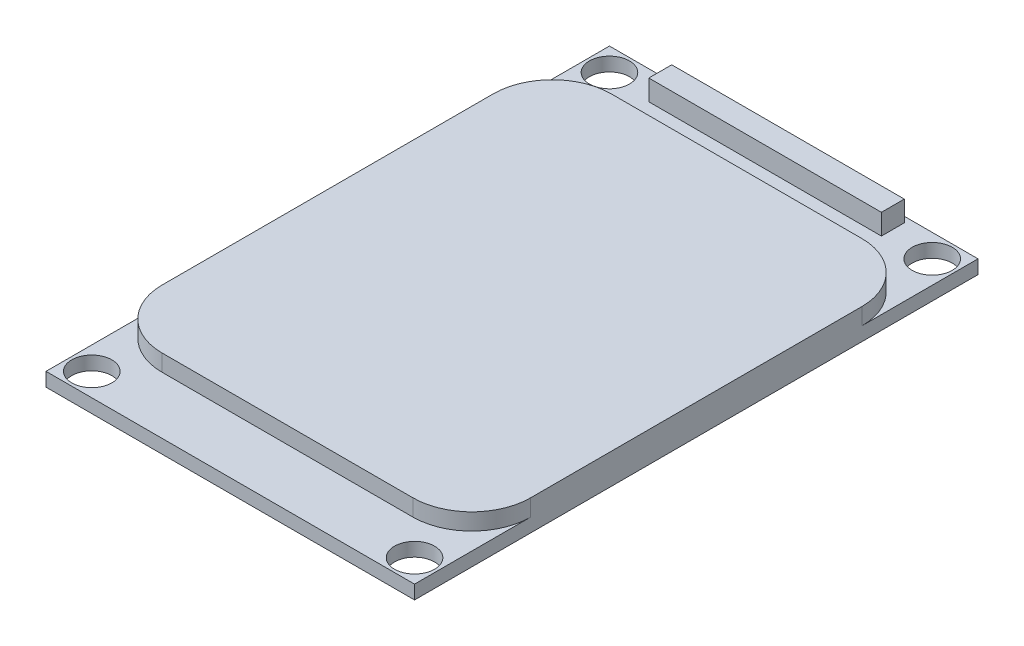
ISO-10303-21;
HEADER;
FILE_DESCRIPTION(('STEP AP214'),'2;1');
FILE_NAME('part.step','',(''),(''),'','','');
FILE_SCHEMA(('AUTOMOTIVE_DESIGN { 1 0 10303 214 1 1 1 1 }'));
ENDSEC;
DATA;
#1=APPLICATION_CONTEXT('core data for automotive mechanical design processes');
#2=APPLICATION_PROTOCOL_DEFINITION('international standard','automotive_design',2000,#1);
#3=PRODUCT_CONTEXT('',#1,'mechanical');
#4=PRODUCT('Part','Part','',(#3));
#5=PRODUCT_RELATED_PRODUCT_CATEGORY('part','',(#4));
#6=PRODUCT_DEFINITION_FORMATION('','',#4);
#7=PRODUCT_DEFINITION_CONTEXT('part definition',#1,'design');
#8=PRODUCT_DEFINITION('design','',#6,#7);
#9=PRODUCT_DEFINITION_SHAPE('','',#8);
#10=(LENGTH_UNIT() NAMED_UNIT(*) SI_UNIT(.MILLI.,.METRE.));
#11=(NAMED_UNIT(*) PLANE_ANGLE_UNIT() SI_UNIT($,.RADIAN.));
#12=(NAMED_UNIT(*) SI_UNIT($,.STERADIAN.) SOLID_ANGLE_UNIT());
#13=UNCERTAINTY_MEASURE_WITH_UNIT(LENGTH_MEASURE(1.E-05),#10,'distance_accuracy_value','');
#14=(GEOMETRIC_REPRESENTATION_CONTEXT(3) GLOBAL_UNCERTAINTY_ASSIGNED_CONTEXT((#13)) GLOBAL_UNIT_ASSIGNED_CONTEXT((#10,
#11,#12)) REPRESENTATION_CONTEXT('',''));
#15=CARTESIAN_POINT('',(0.,0.,0.));
#16=DIRECTION('',(0.,0.,1.));
#17=DIRECTION('',(1.,0.,0.));
#18=AXIS2_PLACEMENT_3D('',#15,#16,#17);
#19=CARTESIAN_POINT('',(0.,1.2,0.));
#20=DIRECTION('',(0.,1.,0.));
#21=DIRECTION('',(0.,0.,1.));
#22=AXIS2_PLACEMENT_3D('',#19,#20,#21);
#23=PLANE('',#22);
#24=CARTESIAN_POINT('',(-13.1368010723274,1.2,28.9138056680162));
#25=DIRECTION('',(0.,1.,0.));
#26=DIRECTION('',(0.,0.,1.));
#27=AXIS2_PLACEMENT_3D('',#24,#25,#26);
#28=CIRCLE('',#27,1.75);
#29=CARTESIAN_POINT('',(-13.1368010723274,1.2,30.6638056680162));
#30=VERTEX_POINT('',#29);
#31=EDGE_CURVE('E168',#30,#30,#28,.T.);
#32=ORIENTED_EDGE('',*,*,#31,.F.);
#33=EDGE_LOOP('',(#32));
#34=FACE_BOUND('',#33,.T.);
#35=CARTESIAN_POINT('',(15.0631989276726,1.2,28.9138056680162));
#36=DIRECTION('',(0.,1.,0.));
#37=DIRECTION('',(0.,0.,1.));
#38=AXIS2_PLACEMENT_3D('',#35,#36,#37);
#39=CIRCLE('',#38,1.75);
#40=CARTESIAN_POINT('',(15.0631989276726,1.2,30.6638056680162));
#41=VERTEX_POINT('',#40);
#42=EDGE_CURVE('E180',#41,#41,#39,.T.);
#43=ORIENTED_EDGE('',*,*,#42,.F.);
#44=EDGE_LOOP('',(#43));
#45=FACE_BOUND('',#44,.T.);
#46=DIRECTION('',(1.,0.,0.));
#47=VECTOR('',#46,1.);
#48=CARTESIAN_POINT('',(11.9131989276726,1.2,25.9138056680162));
#49=LINE('',#48,#47);
#50=CARTESIAN_POINT('',(-9.98680107232734,1.2,25.9138056680162));
#51=VERTEX_POINT('',#50);
#52=CARTESIAN_POINT('',(11.9131989276726,1.2,25.9138056680162));
#53=VERTEX_POINT('',#52);
#54=EDGE_CURVE('E49',#51,#53,#49,.T.);
#55=ORIENTED_EDGE('',*,*,#54,.F.);
#56=CARTESIAN_POINT('',(-9.98680107232738,1.2,20.7638056680162));
#57=DIRECTION('',(0.,1.,0.));
#58=DIRECTION('',(0.,0.,1.));
#59=AXIS2_PLACEMENT_3D('',#56,#57,#58);
#60=CIRCLE('',#59,5.15);
#61=CARTESIAN_POINT('',(-15.1368010723274,1.2,20.7638056680162));
#62=VERTEX_POINT('',#61);
#63=EDGE_CURVE('E167',#62,#51,#60,.T.);
#64=ORIENTED_EDGE('',*,*,#63,.F.);
#65=DIRECTION('',(0.,0.,1.));
#66=VECTOR('',#65,1.);
#67=CARTESIAN_POINT('',(-15.1368010723274,1.2,-18.3161943319838));
#68=LINE('',#67,#66);
#69=CARTESIAN_POINT('',(-15.1368010723274,1.2,30.9138056680162));
#70=VERTEX_POINT('',#69);
#71=EDGE_CURVE('E223',#62,#70,#68,.T.);
#72=ORIENTED_EDGE('',*,*,#71,.T.);
#73=DIRECTION('',(1.,0.,0.));
#74=VECTOR('',#73,1.);
#75=CARTESIAN_POINT('',(-15.1368010723274,1.2,30.9138056680162));
#76=LINE('',#75,#74);
#77=CARTESIAN_POINT('',(17.0631989276726,1.2,30.9138056680162));
#78=VERTEX_POINT('',#77);
#79=EDGE_CURVE('E222',#70,#78,#76,.T.);
#80=ORIENTED_EDGE('',*,*,#79,.T.);
#81=DIRECTION('',(0.,0.,-1.));
#82=VECTOR('',#81,1.);
#83=CARTESIAN_POINT('',(17.0631989276726,1.2,-18.3161943319838));
#84=LINE('',#83,#82);
#85=CARTESIAN_POINT('',(17.0631989276726,1.2,20.7638056680162));
#86=VERTEX_POINT('',#85);
#87=EDGE_CURVE('E226',#78,#86,#84,.T.);
#88=ORIENTED_EDGE('',*,*,#87,.T.);
#89=CARTESIAN_POINT('',(11.9131989276726,1.2,20.7638056680162));
#90=DIRECTION('',(0.,1.,0.));
#91=DIRECTION('',(0.,0.,-1.));
#92=AXIS2_PLACEMENT_3D('',#89,#90,#91);
#93=CIRCLE('',#92,5.15);
#94=EDGE_CURVE('E54',#53,#86,#93,.T.);
#95=ORIENTED_EDGE('',*,*,#94,.F.);
#96=EDGE_LOOP('',(#55,#64,#72,#80,#88,#95));
#97=FACE_BOUND('',#96,.T.);
#98=ADVANCED_FACE('F32',(#34,#45,#97),#23,.T.);
#99=DIRECTION('',(1.,0.,0.));
#100=VECTOR('',#99,1.);
#101=CARTESIAN_POINT('',(-9.19680107232738,1.2,-15.8161943319838));
#102=LINE('',#101,#100);
#103=CARTESIAN_POINT('',(-9.19680107232738,1.2,-15.8161943319838));
#104=VERTEX_POINT('',#103);
#105=CARTESIAN_POINT('',(11.1231989276726,1.2,-15.8161943319838));
#106=VERTEX_POINT('',#105);
#107=EDGE_CURVE('E202',#104,#106,#102,.T.);
#108=ORIENTED_EDGE('',*,*,#107,.F.);
#109=DIRECTION('',(0.,0.,1.));
#110=VECTOR('',#109,1.);
#111=CARTESIAN_POINT('',(-9.19680107232738,1.2,-17.8161943319838));
#112=LINE('',#111,#110);
#113=CARTESIAN_POINT('',(-9.19680107232738,1.2,-17.8161943319838));
#114=VERTEX_POINT('',#113);
#115=EDGE_CURVE('E199',#114,#104,#112,.T.);
#116=ORIENTED_EDGE('',*,*,#115,.F.);
#117=DIRECTION('',(1.,0.,0.));
#118=VECTOR('',#117,1.);
#119=CARTESIAN_POINT('',(-9.19680107232738,1.2,-17.8161943319838));
#120=LINE('',#119,#118);
#121=CARTESIAN_POINT('',(11.1231989276726,1.2,-17.8161943319838));
#122=VERTEX_POINT('',#121);
#123=EDGE_CURVE('E190',#114,#122,#120,.T.);
#124=ORIENTED_EDGE('',*,*,#123,.T.);
#125=DIRECTION('',(0.,0.,1.));
#126=VECTOR('',#125,1.);
#127=CARTESIAN_POINT('',(11.1231989276726,1.2,-17.8161943319838));
#128=LINE('',#127,#126);
#129=EDGE_CURVE('E205',#122,#106,#128,.T.);
#130=ORIENTED_EDGE('',*,*,#129,.T.);
#131=EDGE_LOOP('',(#108,#116,#124,#130));
#132=FACE_BOUND('',#131,.T.);
#133=CARTESIAN_POINT('',(15.0631989276726,1.2,-16.3161943319838));
#134=DIRECTION('',(0.,1.,0.));
#135=DIRECTION('',(0.,0.,1.));
#136=AXIS2_PLACEMENT_3D('',#133,#134,#135);
#137=CIRCLE('',#136,1.75);
#138=CARTESIAN_POINT('',(15.0631989276726,1.2,-14.5661943319838));
#139=VERTEX_POINT('',#138);
#140=EDGE_CURVE('E177',#139,#139,#137,.T.);
#141=ORIENTED_EDGE('',*,*,#140,.F.);
#142=EDGE_LOOP('',(#141));
#143=FACE_BOUND('',#142,.T.);
#144=CARTESIAN_POINT('',(-13.1368010723274,1.2,-16.3161943319838));
#145=DIRECTION('',(0.,1.,0.));
#146=DIRECTION('',(0.,0.,1.));
#147=AXIS2_PLACEMENT_3D('',#144,#145,#146);
#148=CIRCLE('',#147,1.75);
#149=CARTESIAN_POINT('',(-13.1368010723274,1.2,-14.5661943319838));
#150=VERTEX_POINT('',#149);
#151=EDGE_CURVE('E171',#150,#150,#148,.T.);
#152=ORIENTED_EDGE('',*,*,#151,.F.);
#153=EDGE_LOOP('',(#152));
#154=FACE_BOUND('',#153,.T.);
#155=DIRECTION('',(-1.,0.,0.));
#156=VECTOR('',#155,1.);
#157=CARTESIAN_POINT('',(-9.98680107232734,1.2,-13.3161943319838));
#158=LINE('',#157,#156);
#159=CARTESIAN_POINT('',(11.9131989276726,1.2,-13.3161943319838));
#160=VERTEX_POINT('',#159);
#161=CARTESIAN_POINT('',(-9.98680107232734,1.2,-13.3161943319838));
#162=VERTEX_POINT('',#161);
#163=EDGE_CURVE('E329',#160,#162,#158,.T.);
#164=ORIENTED_EDGE('',*,*,#163,.F.);
#165=CARTESIAN_POINT('',(11.9131989276726,1.2,-8.1661943319838));
#166=DIRECTION('',(0.,1.,0.));
#167=DIRECTION('',(0.,0.,1.));
#168=AXIS2_PLACEMENT_3D('',#165,#166,#167);
#169=CIRCLE('',#168,5.15);
#170=CARTESIAN_POINT('',(17.0631989276726,1.2,-8.16619433198376));
#171=VERTEX_POINT('',#170);
#172=EDGE_CURVE('E331',#171,#160,#169,.T.);
#173=ORIENTED_EDGE('',*,*,#172,.F.);
#174=CARTESIAN_POINT('',(17.0631989276726,1.2,-18.3161943319838));
#175=VERTEX_POINT('',#174);
#176=EDGE_CURVE('E225',#171,#175,#84,.T.);
#177=ORIENTED_EDGE('',*,*,#176,.T.);
#178=DIRECTION('',(-1.,0.,0.));
#179=VECTOR('',#178,1.);
#180=CARTESIAN_POINT('',(-15.1368010723274,1.2,-18.3161943319838));
#181=LINE('',#180,#179);
#182=CARTESIAN_POINT('',(-15.1368010723274,1.2,-18.3161943319838));
#183=VERTEX_POINT('',#182);
#184=EDGE_CURVE('E228',#175,#183,#181,.T.);
#185=ORIENTED_EDGE('',*,*,#184,.T.);
#186=CARTESIAN_POINT('',(-15.1368010723274,1.2,-8.16619433198376));
#187=VERTEX_POINT('',#186);
#188=EDGE_CURVE('E220',#183,#187,#68,.T.);
#189=ORIENTED_EDGE('',*,*,#188,.T.);
#190=CARTESIAN_POINT('',(-9.98680107232738,1.2,-8.1661943319838));
#191=DIRECTION('',(0.,1.,0.));
#192=DIRECTION('',(0.,0.,1.));
#193=AXIS2_PLACEMENT_3D('',#190,#191,#192);
#194=CIRCLE('',#193,5.15);
#195=EDGE_CURVE('E164',#162,#187,#194,.T.);
#196=ORIENTED_EDGE('',*,*,#195,.F.);
#197=EDGE_LOOP('',(#164,#173,#177,#185,#189,#196));
#198=FACE_BOUND('',#197,.T.);
#199=ADVANCED_FACE('F275',(#132,#143,#154,#198),#23,.T.);
#200=CARTESIAN_POINT('',(-15.1368010723274,1.2,-18.3161943319838));
#201=DIRECTION('',(1.,0.,0.));
#202=DIRECTION('',(0.,0.,-1.));
#203=AXIS2_PLACEMENT_3D('',#200,#201,#202);
#204=PLANE('',#203);
#205=DIRECTION('',(0.,0.,1.));
#206=VECTOR('',#205,1.);
#207=CARTESIAN_POINT('',(-15.1368010723274,0.,-18.3161943319838));
#208=LINE('',#207,#206);
#209=CARTESIAN_POINT('',(-15.1368010723274,0.,-18.3161943319838));
#210=VERTEX_POINT('',#209);
#211=CARTESIAN_POINT('',(-15.1368010723274,0.,30.9138056680162));
#212=VERTEX_POINT('',#211);
#213=EDGE_CURVE('E219',#210,#212,#208,.T.);
#214=ORIENTED_EDGE('',*,*,#213,.T.);
#215=DIRECTION('',(0.,-1.,0.));
#216=VECTOR('',#215,1.);
#217=CARTESIAN_POINT('',(-15.1368010723274,1.2,30.9138056680162));
#218=LINE('',#217,#216);
#219=EDGE_CURVE('E11',#70,#212,#218,.T.);
#220=ORIENTED_EDGE('',*,*,#219,.F.);
#221=ORIENTED_EDGE('',*,*,#71,.F.);
#222=DIRECTION('',(0.,-1.,0.));
#223=VECTOR('',#222,1.);
#224=CARTESIAN_POINT('',(-15.1368010723274,2.66,20.7638056680162));
#225=LINE('',#224,#223);
#226=CARTESIAN_POINT('',(-15.1368010723274,2.66,20.7638056680162));
#227=VERTEX_POINT('',#226);
#228=EDGE_CURVE('E335',#227,#62,#225,.T.);
#229=ORIENTED_EDGE('',*,*,#228,.F.);
#230=DIRECTION('',(0.,0.,1.));
#231=VECTOR('',#230,1.);
#232=CARTESIAN_POINT('',(-15.1368010723274,2.66,20.7638056680162));
#233=LINE('',#232,#231);
#234=CARTESIAN_POINT('',(-15.1368010723274,2.66,-8.16619433198376));
#235=VERTEX_POINT('',#234);
#236=EDGE_CURVE('E160',#235,#227,#233,.T.);
#237=ORIENTED_EDGE('',*,*,#236,.F.);
#238=DIRECTION('',(0.,-1.,0.));
#239=VECTOR('',#238,1.);
#240=CARTESIAN_POINT('',(-15.1368010723274,2.66,-8.16619433198376));
#241=LINE('',#240,#239);
#242=EDGE_CURVE('E319',#235,#187,#241,.T.);
#243=ORIENTED_EDGE('',*,*,#242,.T.);
#244=ORIENTED_EDGE('',*,*,#188,.F.);
#245=DIRECTION('',(0.,-1.,0.));
#246=VECTOR('',#245,1.);
#247=CARTESIAN_POINT('',(-15.1368010723274,1.2,-18.3161943319838));
#248=LINE('',#247,#246);
#249=EDGE_CURVE('E230',#183,#210,#248,.T.);
#250=ORIENTED_EDGE('',*,*,#249,.T.);
#251=EDGE_LOOP('',(#214,#220,#221,#229,#237,#243,#244,#250));
#252=FACE_BOUND('',#251,.T.);
#253=ADVANCED_FACE('F34',(#252),#204,.F.);
#254=CARTESIAN_POINT('',(-15.1368010723274,1.2,30.9138056680162));
#255=DIRECTION('',(0.,0.,-1.));
#256=DIRECTION('',(-1.,0.,0.));
#257=AXIS2_PLACEMENT_3D('',#254,#255,#256);
#258=PLANE('',#257);
#259=DIRECTION('',(1.,0.,0.));
#260=VECTOR('',#259,1.);
#261=CARTESIAN_POINT('',(-15.1368010723274,0.,30.9138056680162));
#262=LINE('',#261,#260);
#263=CARTESIAN_POINT('',(17.0631989276726,0.,30.9138056680162));
#264=VERTEX_POINT('',#263);
#265=EDGE_CURVE('E233',#212,#264,#262,.T.);
#266=ORIENTED_EDGE('',*,*,#265,.T.);
#267=DIRECTION('',(0.,-1.,0.));
#268=VECTOR('',#267,1.);
#269=CARTESIAN_POINT('',(17.0631989276726,1.2,30.9138056680162));
#270=LINE('',#269,#268);
#271=EDGE_CURVE('E41',#78,#264,#270,.T.);
#272=ORIENTED_EDGE('',*,*,#271,.F.);
#273=ORIENTED_EDGE('',*,*,#79,.F.);
#274=ORIENTED_EDGE('',*,*,#219,.T.);
#275=EDGE_LOOP('',(#266,#272,#273,#274));
#276=FACE_BOUND('',#275,.T.);
#277=ADVANCED_FACE('F296',(#276),#258,.F.);
#278=CARTESIAN_POINT('',(17.0631989276726,1.2,-18.3161943319838));
#279=DIRECTION('',(-1.,0.,0.));
#280=DIRECTION('',(0.,0.,1.));
#281=AXIS2_PLACEMENT_3D('',#278,#279,#280);
#282=PLANE('',#281);
#283=DIRECTION('',(0.,0.,-1.));
#284=VECTOR('',#283,1.);
#285=CARTESIAN_POINT('',(17.0631989276726,0.,-18.3161943319838));
#286=LINE('',#285,#284);
#287=CARTESIAN_POINT('',(17.0631989276726,0.,-18.3161943319838));
#288=VERTEX_POINT('',#287);
#289=EDGE_CURVE('E235',#264,#288,#286,.T.);
#290=ORIENTED_EDGE('',*,*,#289,.T.);
#291=DIRECTION('',(0.,-1.,0.));
#292=VECTOR('',#291,1.);
#293=CARTESIAN_POINT('',(17.0631989276726,1.2,-18.3161943319838));
#294=LINE('',#293,#292);
#295=EDGE_CURVE('E241',#175,#288,#294,.T.);
#296=ORIENTED_EDGE('',*,*,#295,.F.);
#297=ORIENTED_EDGE('',*,*,#176,.F.);
#298=DIRECTION('',(0.,-1.,0.));
#299=VECTOR('',#298,1.);
#300=CARTESIAN_POINT('',(17.0631989276726,2.66,-8.16619433198376));
#301=LINE('',#300,#299);
#302=CARTESIAN_POINT('',(17.0631989276726,2.66,-8.16619433198376));
#303=VERTEX_POINT('',#302);
#304=EDGE_CURVE('E342',#303,#171,#301,.T.);
#305=ORIENTED_EDGE('',*,*,#304,.F.);
#306=DIRECTION('',(0.,0.,-1.));
#307=VECTOR('',#306,1.);
#308=CARTESIAN_POINT('',(17.0631989276726,2.66,-8.16619433198376));
#309=LINE('',#308,#307);
#310=CARTESIAN_POINT('',(17.0631989276726,2.66,20.7638056680162));
#311=VERTEX_POINT('',#310);
#312=EDGE_CURVE('E347',#311,#303,#309,.T.);
#313=ORIENTED_EDGE('',*,*,#312,.F.);
#314=DIRECTION('',(0.,-1.,0.));
#315=VECTOR('',#314,1.);
#316=CARTESIAN_POINT('',(17.0631989276726,2.66,20.7638056680162));
#317=LINE('',#316,#315);
#318=EDGE_CURVE('E173',#311,#86,#317,.T.);
#319=ORIENTED_EDGE('',*,*,#318,.T.);
#320=ORIENTED_EDGE('',*,*,#87,.F.);
#321=ORIENTED_EDGE('',*,*,#271,.T.);
#322=EDGE_LOOP('',(#290,#296,#297,#305,#313,#319,#320,#321));
#323=FACE_BOUND('',#322,.T.);
#324=ADVANCED_FACE('F293',(#323),#282,.F.);
#325=CARTESIAN_POINT('',(-15.1368010723274,1.2,-18.3161943319838));
#326=DIRECTION('',(0.,0.,1.));
#327=DIRECTION('',(1.,0.,0.));
#328=AXIS2_PLACEMENT_3D('',#325,#326,#327);
#329=PLANE('',#328);
#330=DIRECTION('',(-1.,0.,0.));
#331=VECTOR('',#330,1.);
#332=CARTESIAN_POINT('',(-15.1368010723274,0.,-18.3161943319838));
#333=LINE('',#332,#331);
#334=EDGE_CURVE('E237',#288,#210,#333,.T.);
#335=ORIENTED_EDGE('',*,*,#334,.T.);
#336=ORIENTED_EDGE('',*,*,#249,.F.);
#337=ORIENTED_EDGE('',*,*,#184,.F.);
#338=ORIENTED_EDGE('',*,*,#295,.T.);
#339=EDGE_LOOP('',(#335,#336,#337,#338));
#340=FACE_BOUND('',#339,.T.);
#341=ADVANCED_FACE('F290',(#340),#329,.F.);
#342=CARTESIAN_POINT('',(0.,0.,0.));
#343=DIRECTION('',(0.,1.,0.));
#344=DIRECTION('',(0.,0.,1.));
#345=AXIS2_PLACEMENT_3D('',#342,#343,#344);
#346=PLANE('',#345);
#347=CARTESIAN_POINT('',(-13.1368010723274,0.,28.9138056680162));
#348=DIRECTION('',(0.,1.,0.));
#349=DIRECTION('',(0.,0.,1.));
#350=AXIS2_PLACEMENT_3D('',#347,#348,#349);
#351=CIRCLE('',#350,1.75);
#352=CARTESIAN_POINT('',(-13.1368010723274,0.,30.6638056680162));
#353=VERTEX_POINT('',#352);
#354=EDGE_CURVE('E36',#353,#353,#351,.T.);
#355=ORIENTED_EDGE('',*,*,#354,.T.);
#356=EDGE_LOOP('',(#355));
#357=FACE_BOUND('',#356,.T.);
#358=CARTESIAN_POINT('',(-13.1368010723274,0.,-16.3161943319838));
#359=DIRECTION('',(0.,1.,0.));
#360=DIRECTION('',(0.,0.,1.));
#361=AXIS2_PLACEMENT_3D('',#358,#359,#360);
#362=CIRCLE('',#361,1.75);
#363=CARTESIAN_POINT('',(-13.1368010723274,0.,-14.5661943319838));
#364=VERTEX_POINT('',#363);
#365=EDGE_CURVE('E250',#364,#364,#362,.T.);
#366=ORIENTED_EDGE('',*,*,#365,.T.);
#367=EDGE_LOOP('',(#366));
#368=FACE_BOUND('',#367,.T.);
#369=CARTESIAN_POINT('',(15.0631989276726,0.,-16.3161943319838));
#370=DIRECTION('',(0.,1.,0.));
#371=DIRECTION('',(0.,0.,1.));
#372=AXIS2_PLACEMENT_3D('',#369,#370,#371);
#373=CIRCLE('',#372,1.75);
#374=CARTESIAN_POINT('',(15.0631989276726,0.,-14.5661943319838));
#375=VERTEX_POINT('',#374);
#376=EDGE_CURVE('E248',#375,#375,#373,.T.);
#377=ORIENTED_EDGE('',*,*,#376,.T.);
#378=EDGE_LOOP('',(#377));
#379=FACE_BOUND('',#378,.T.);
#380=CARTESIAN_POINT('',(15.0631989276726,0.,28.9138056680162));
#381=DIRECTION('',(0.,1.,0.));
#382=DIRECTION('',(0.,0.,1.));
#383=AXIS2_PLACEMENT_3D('',#380,#381,#382);
#384=CIRCLE('',#383,1.75);
#385=CARTESIAN_POINT('',(15.0631989276726,0.,30.6638056680162));
#386=VERTEX_POINT('',#385);
#387=EDGE_CURVE('E185',#386,#386,#384,.T.);
#388=ORIENTED_EDGE('',*,*,#387,.T.);
#389=EDGE_LOOP('',(#388));
#390=FACE_BOUND('',#389,.T.);
#391=ORIENTED_EDGE('',*,*,#213,.F.);
#392=ORIENTED_EDGE('',*,*,#334,.F.);
#393=ORIENTED_EDGE('',*,*,#289,.F.);
#394=ORIENTED_EDGE('',*,*,#265,.F.);
#395=EDGE_LOOP('',(#391,#392,#393,#394));
#396=FACE_BOUND('',#395,.T.);
#397=ADVANCED_FACE('F257',(#357,#368,#379,#390,#396),#346,.F.);
#398=CARTESIAN_POINT('',(-9.19680107232738,3.,-17.8161943319838));
#399=DIRECTION('',(1.,0.,0.));
#400=DIRECTION('',(0.,0.,-1.));
#401=AXIS2_PLACEMENT_3D('',#398,#399,#400);
#402=PLANE('',#401);
#403=ORIENTED_EDGE('',*,*,#115,.T.);
#404=DIRECTION('',(0.,-1.,0.));
#405=VECTOR('',#404,1.);
#406=CARTESIAN_POINT('',(-9.19680107232738,3.,-15.8161943319838));
#407=LINE('',#406,#405);
#408=CARTESIAN_POINT('',(-9.19680107232738,3.,-15.8161943319838));
#409=VERTEX_POINT('',#408);
#410=EDGE_CURVE('E216',#409,#104,#407,.T.);
#411=ORIENTED_EDGE('',*,*,#410,.F.);
#412=DIRECTION('',(0.,0.,1.));
#413=VECTOR('',#412,1.);
#414=CARTESIAN_POINT('',(-9.19680107232738,3.,-17.8161943319838));
#415=LINE('',#414,#413);
#416=CARTESIAN_POINT('',(-9.19680107232738,3.,-17.8161943319838));
#417=VERTEX_POINT('',#416);
#418=EDGE_CURVE('E186',#417,#409,#415,.T.);
#419=ORIENTED_EDGE('',*,*,#418,.F.);
#420=DIRECTION('',(0.,-1.,0.));
#421=VECTOR('',#420,1.);
#422=CARTESIAN_POINT('',(-9.19680107232738,3.,-17.8161943319838));
#423=LINE('',#422,#421);
#424=EDGE_CURVE('E198',#417,#114,#423,.T.);
#425=ORIENTED_EDGE('',*,*,#424,.T.);
#426=EDGE_LOOP('',(#403,#411,#419,#425));
#427=FACE_BOUND('',#426,.T.);
#428=ADVANCED_FACE('F286',(#427),#402,.F.);
#429=CARTESIAN_POINT('',(-9.19680107232738,3.,-15.8161943319838));
#430=DIRECTION('',(0.,0.,-1.));
#431=DIRECTION('',(-1.,0.,0.));
#432=AXIS2_PLACEMENT_3D('',#429,#430,#431);
#433=PLANE('',#432);
#434=ORIENTED_EDGE('',*,*,#107,.T.);
#435=DIRECTION('',(0.,-1.,0.));
#436=VECTOR('',#435,1.);
#437=CARTESIAN_POINT('',(11.1231989276726,3.,-15.8161943319838));
#438=LINE('',#437,#436);
#439=CARTESIAN_POINT('',(11.1231989276726,3.,-15.8161943319838));
#440=VERTEX_POINT('',#439);
#441=EDGE_CURVE('E213',#440,#106,#438,.T.);
#442=ORIENTED_EDGE('',*,*,#441,.F.);
#443=DIRECTION('',(1.,0.,0.));
#444=VECTOR('',#443,1.);
#445=CARTESIAN_POINT('',(-9.19680107232738,3.,-15.8161943319838));
#446=LINE('',#445,#444);
#447=EDGE_CURVE('E189',#409,#440,#446,.T.);
#448=ORIENTED_EDGE('',*,*,#447,.F.);
#449=ORIENTED_EDGE('',*,*,#410,.T.);
#450=EDGE_LOOP('',(#434,#442,#448,#449));
#451=FACE_BOUND('',#450,.T.);
#452=ADVANCED_FACE('F416',(#451),#433,.F.);
#453=CARTESIAN_POINT('',(11.1231989276726,3.,-17.8161943319838));
#454=DIRECTION('',(1.,0.,0.));
#455=DIRECTION('',(0.,0.,-1.));
#456=AXIS2_PLACEMENT_3D('',#453,#454,#455);
#457=PLANE('',#456);
#458=ORIENTED_EDGE('',*,*,#129,.F.);
#459=DIRECTION('',(0.,-1.,0.));
#460=VECTOR('',#459,1.);
#461=CARTESIAN_POINT('',(11.1231989276726,3.,-17.8161943319838));
#462=LINE('',#461,#460);
#463=CARTESIAN_POINT('',(11.1231989276726,3.,-17.8161943319838));
#464=VERTEX_POINT('',#463);
#465=EDGE_CURVE('E210',#464,#122,#462,.T.);
#466=ORIENTED_EDGE('',*,*,#465,.F.);
#467=DIRECTION('',(0.,0.,1.));
#468=VECTOR('',#467,1.);
#469=CARTESIAN_POINT('',(11.1231989276726,3.,-17.8161943319838));
#470=LINE('',#469,#468);
#471=EDGE_CURVE('E192',#464,#440,#470,.T.);
#472=ORIENTED_EDGE('',*,*,#471,.T.);
#473=ORIENTED_EDGE('',*,*,#441,.T.);
#474=EDGE_LOOP('',(#458,#466,#472,#473));
#475=FACE_BOUND('',#474,.T.);
#476=ADVANCED_FACE('F413',(#475),#457,.T.);
#477=CARTESIAN_POINT('',(-9.19680107232738,3.,-17.8161943319838));
#478=DIRECTION('',(0.,0.,-1.));
#479=DIRECTION('',(-1.,0.,0.));
#480=AXIS2_PLACEMENT_3D('',#477,#478,#479);
#481=PLANE('',#480);
#482=ORIENTED_EDGE('',*,*,#123,.F.);
#483=ORIENTED_EDGE('',*,*,#424,.F.);
#484=DIRECTION('',(1.,0.,0.));
#485=VECTOR('',#484,1.);
#486=CARTESIAN_POINT('',(-9.19680107232738,3.,-17.8161943319838));
#487=LINE('',#486,#485);
#488=EDGE_CURVE('E195',#417,#464,#487,.T.);
#489=ORIENTED_EDGE('',*,*,#488,.T.);
#490=ORIENTED_EDGE('',*,*,#465,.T.);
#491=EDGE_LOOP('',(#482,#483,#489,#490));
#492=FACE_BOUND('',#491,.T.);
#493=ADVANCED_FACE('F407',(#492),#481,.T.);
#494=CARTESIAN_POINT('',(0.,3.,0.));
#495=DIRECTION('',(0.,1.,0.));
#496=DIRECTION('',(0.,0.,1.));
#497=AXIS2_PLACEMENT_3D('',#494,#495,#496);
#498=PLANE('',#497);
#499=ORIENTED_EDGE('',*,*,#418,.T.);
#500=ORIENTED_EDGE('',*,*,#447,.T.);
#501=ORIENTED_EDGE('',*,*,#471,.F.);
#502=ORIENTED_EDGE('',*,*,#488,.F.);
#503=EDGE_LOOP('',(#499,#500,#501,#502));
#504=FACE_BOUND('',#503,.T.);
#505=ADVANCED_FACE('F391',(#504),#498,.T.);
#506=CARTESIAN_POINT('',(15.0631989276726,-0.6,28.9138056680162));
#507=DIRECTION('',(0.,1.,0.));
#508=DIRECTION('',(0.,0.,1.));
#509=AXIS2_PLACEMENT_3D('',#506,#507,#508);
#510=CYLINDRICAL_SURFACE('',#509,1.75);
#511=ORIENTED_EDGE('',*,*,#42,.T.);
#512=EDGE_LOOP('',(#511));
#513=FACE_BOUND('',#512,.T.);
#514=ORIENTED_EDGE('',*,*,#387,.F.);
#515=EDGE_LOOP('',(#514));
#516=FACE_BOUND('',#515,.T.);
#517=ADVANCED_FACE('F386',(#513,#516),#510,.F.);
#518=CARTESIAN_POINT('',(15.0631989276726,-0.6,-16.3161943319838));
#519=DIRECTION('',(0.,1.,0.));
#520=DIRECTION('',(0.,0.,1.));
#521=AXIS2_PLACEMENT_3D('',#518,#519,#520);
#522=CYLINDRICAL_SURFACE('',#521,1.75);
#523=ORIENTED_EDGE('',*,*,#140,.T.);
#524=EDGE_LOOP('',(#523));
#525=FACE_BOUND('',#524,.T.);
#526=ORIENTED_EDGE('',*,*,#376,.F.);
#527=EDGE_LOOP('',(#526));
#528=FACE_BOUND('',#527,.T.);
#529=ADVANCED_FACE('F270',(#525,#528),#522,.F.);
#530=CARTESIAN_POINT('',(-13.1368010723274,-0.6,-16.3161943319838));
#531=DIRECTION('',(0.,1.,0.));
#532=DIRECTION('',(0.,0.,1.));
#533=AXIS2_PLACEMENT_3D('',#530,#531,#532);
#534=CYLINDRICAL_SURFACE('',#533,1.75);
#535=ORIENTED_EDGE('',*,*,#151,.T.);
#536=EDGE_LOOP('',(#535));
#537=FACE_BOUND('',#536,.T.);
#538=ORIENTED_EDGE('',*,*,#365,.F.);
#539=EDGE_LOOP('',(#538));
#540=FACE_BOUND('',#539,.T.);
#541=ADVANCED_FACE('F261',(#537,#540),#534,.F.);
#542=CARTESIAN_POINT('',(-13.1368010723274,-0.6,28.9138056680162));
#543=DIRECTION('',(0.,1.,0.));
#544=DIRECTION('',(0.,0.,1.));
#545=AXIS2_PLACEMENT_3D('',#542,#543,#544);
#546=CYLINDRICAL_SURFACE('',#545,1.75);
#547=ORIENTED_EDGE('',*,*,#31,.T.);
#548=EDGE_LOOP('',(#547));
#549=FACE_BOUND('',#548,.T.);
#550=ORIENTED_EDGE('',*,*,#354,.F.);
#551=EDGE_LOOP('',(#550));
#552=FACE_BOUND('',#551,.T.);
#553=ADVANCED_FACE('F259',(#549,#552),#546,.F.);
#554=CARTESIAN_POINT('',(-9.98680107232738,2.66,20.7638056680162));
#555=DIRECTION('',(0.,-1.,0.));
#556=DIRECTION('',(0.,0.,-1.));
#557=AXIS2_PLACEMENT_3D('',#554,#555,#556);
#558=CYLINDRICAL_SURFACE('',#557,5.15);
#559=ORIENTED_EDGE('',*,*,#63,.T.);
#560=DIRECTION('',(0.,-1.,0.));
#561=VECTOR('',#560,1.);
#562=CARTESIAN_POINT('',(-9.98680107232734,2.66,25.9138056680162));
#563=LINE('',#562,#561);
#564=CARTESIAN_POINT('',(-9.98680107232734,2.66,25.9138056680162));
#565=VERTEX_POINT('',#564);
#566=EDGE_CURVE('E148',#565,#51,#563,.T.);
#567=ORIENTED_EDGE('',*,*,#566,.F.);
#568=CARTESIAN_POINT('',(-9.98680107232738,2.66,20.7638056680162));
#569=DIRECTION('',(0.,1.,0.));
#570=DIRECTION('',(0.,0.,1.));
#571=AXIS2_PLACEMENT_3D('',#568,#569,#570);
#572=CIRCLE('',#571,5.15);
#573=EDGE_CURVE('E155',#227,#565,#572,.T.);
#574=ORIENTED_EDGE('',*,*,#573,.F.);
#575=ORIENTED_EDGE('',*,*,#228,.T.);
#576=EDGE_LOOP('',(#559,#567,#574,#575));
#577=FACE_BOUND('',#576,.T.);
#578=ADVANCED_FACE('F166',(#577),#558,.T.);
#579=CARTESIAN_POINT('',(11.9131989276726,2.66,25.9138056680162));
#580=DIRECTION('',(0.,0.,-1.));
#581=DIRECTION('',(-1.,0.,0.));
#582=AXIS2_PLACEMENT_3D('',#579,#580,#581);
#583=PLANE('',#582);
#584=ORIENTED_EDGE('',*,*,#54,.T.);
#585=DIRECTION('',(0.,-1.,0.));
#586=VECTOR('',#585,1.);
#587=CARTESIAN_POINT('',(11.9131989276726,2.66,25.9138056680162));
#588=LINE('',#587,#586);
#589=CARTESIAN_POINT('',(11.9131989276726,2.66,25.9138056680162));
#590=VERTEX_POINT('',#589);
#591=EDGE_CURVE('E151',#590,#53,#588,.T.);
#592=ORIENTED_EDGE('',*,*,#591,.F.);
#593=DIRECTION('',(1.,0.,0.));
#594=VECTOR('',#593,1.);
#595=CARTESIAN_POINT('',(11.9131989276726,2.66,25.9138056680162));
#596=LINE('',#595,#594);
#597=EDGE_CURVE('E144',#565,#590,#596,.T.);
#598=ORIENTED_EDGE('',*,*,#597,.F.);
#599=ORIENTED_EDGE('',*,*,#566,.T.);
#600=EDGE_LOOP('',(#584,#592,#598,#599));
#601=FACE_BOUND('',#600,.T.);
#602=ADVANCED_FACE('F146',(#601),#583,.F.);
#603=CARTESIAN_POINT('',(11.9131989276726,2.66,20.7638056680162));
#604=DIRECTION('',(0.,-1.,0.));
#605=DIRECTION('',(0.,0.,-1.));
#606=AXIS2_PLACEMENT_3D('',#603,#604,#605);
#607=CYLINDRICAL_SURFACE('',#606,5.15);
#608=ORIENTED_EDGE('',*,*,#94,.T.);
#609=ORIENTED_EDGE('',*,*,#318,.F.);
#610=CARTESIAN_POINT('',(11.9131989276726,2.66,20.7638056680162));
#611=DIRECTION('',(0.,1.,0.));
#612=DIRECTION('',(0.,0.,-1.));
#613=AXIS2_PLACEMENT_3D('',#610,#611,#612);
#614=CIRCLE('',#613,5.15);
#615=EDGE_CURVE('E154',#590,#311,#614,.T.);
#616=ORIENTED_EDGE('',*,*,#615,.F.);
#617=ORIENTED_EDGE('',*,*,#591,.T.);
#618=EDGE_LOOP('',(#608,#609,#616,#617));
#619=FACE_BOUND('',#618,.T.);
#620=ADVANCED_FACE('F349',(#619),#607,.T.);
#621=CARTESIAN_POINT('',(11.9131989276726,2.66,-8.1661943319838));
#622=DIRECTION('',(0.,-1.,0.));
#623=DIRECTION('',(0.,0.,-1.));
#624=AXIS2_PLACEMENT_3D('',#621,#622,#623);
#625=CYLINDRICAL_SURFACE('',#624,5.15);
#626=ORIENTED_EDGE('',*,*,#172,.T.);
#627=DIRECTION('',(0.,-1.,0.));
#628=VECTOR('',#627,1.);
#629=CARTESIAN_POINT('',(11.9131989276726,2.66,-13.3161943319838));
#630=LINE('',#629,#628);
#631=CARTESIAN_POINT('',(11.9131989276726,2.66,-13.3161943319838));
#632=VERTEX_POINT('',#631);
#633=EDGE_CURVE('E339',#632,#160,#630,.T.);
#634=ORIENTED_EDGE('',*,*,#633,.F.);
#635=CARTESIAN_POINT('',(11.9131989276726,2.66,-8.1661943319838));
#636=DIRECTION('',(0.,1.,0.));
#637=DIRECTION('',(0.,0.,1.));
#638=AXIS2_PLACEMENT_3D('',#635,#636,#637);
#639=CIRCLE('',#638,5.15);
#640=EDGE_CURVE('E360',#303,#632,#639,.T.);
#641=ORIENTED_EDGE('',*,*,#640,.F.);
#642=ORIENTED_EDGE('',*,*,#304,.T.);
#643=EDGE_LOOP('',(#626,#634,#641,#642));
#644=FACE_BOUND('',#643,.T.);
#645=ADVANCED_FACE('F367',(#644),#625,.T.);
#646=CARTESIAN_POINT('',(-9.98680107232734,2.66,-13.3161943319838));
#647=DIRECTION('',(0.,0.,1.));
#648=DIRECTION('',(1.,0.,0.));
#649=AXIS2_PLACEMENT_3D('',#646,#647,#648);
#650=PLANE('',#649);
#651=ORIENTED_EDGE('',*,*,#163,.T.);
#652=DIRECTION('',(0.,-1.,0.));
#653=VECTOR('',#652,1.);
#654=CARTESIAN_POINT('',(-9.98680107232734,2.66,-13.3161943319838));
#655=LINE('',#654,#653);
#656=CARTESIAN_POINT('',(-9.98680107232734,2.66,-13.3161943319838));
#657=VERTEX_POINT('',#656);
#658=EDGE_CURVE('E328',#657,#162,#655,.T.);
#659=ORIENTED_EDGE('',*,*,#658,.F.);
#660=DIRECTION('',(-1.,0.,0.));
#661=VECTOR('',#660,1.);
#662=CARTESIAN_POINT('',(-9.98680107232734,2.66,-13.3161943319838));
#663=LINE('',#662,#661);
#664=EDGE_CURVE('E358',#632,#657,#663,.T.);
#665=ORIENTED_EDGE('',*,*,#664,.F.);
#666=ORIENTED_EDGE('',*,*,#633,.T.);
#667=EDGE_LOOP('',(#651,#659,#665,#666));
#668=FACE_BOUND('',#667,.T.);
#669=ADVANCED_FACE('F370',(#668),#650,.F.);
#670=CARTESIAN_POINT('',(-9.98680107232738,2.66,-8.1661943319838));
#671=DIRECTION('',(0.,-1.,0.));
#672=DIRECTION('',(0.,0.,-1.));
#673=AXIS2_PLACEMENT_3D('',#670,#671,#672);
#674=CYLINDRICAL_SURFACE('',#673,5.15);
#675=ORIENTED_EDGE('',*,*,#195,.T.);
#676=ORIENTED_EDGE('',*,*,#242,.F.);
#677=CARTESIAN_POINT('',(-9.98680107232738,2.66,-8.1661943319838));
#678=DIRECTION('',(0.,1.,0.));
#679=DIRECTION('',(0.,0.,1.));
#680=AXIS2_PLACEMENT_3D('',#677,#678,#679);
#681=CIRCLE('',#680,5.15);
#682=EDGE_CURVE('E356',#657,#235,#681,.T.);
#683=ORIENTED_EDGE('',*,*,#682,.F.);
#684=ORIENTED_EDGE('',*,*,#658,.T.);
#685=EDGE_LOOP('',(#675,#676,#683,#684));
#686=FACE_BOUND('',#685,.T.);
#687=ADVANCED_FACE('F325',(#686),#674,.T.);
#688=CARTESIAN_POINT('',(-9.98680107232738,2.66,20.7638056680162));
#689=DIRECTION('',(0.,1.,0.));
#690=DIRECTION('',(0.,0.,1.));
#691=AXIS2_PLACEMENT_3D('',#688,#689,#690);
#692=PLANE('',#691);
#693=ORIENTED_EDGE('',*,*,#573,.T.);
#694=ORIENTED_EDGE('',*,*,#597,.T.);
#695=ORIENTED_EDGE('',*,*,#615,.T.);
#696=ORIENTED_EDGE('',*,*,#312,.T.);
#697=ORIENTED_EDGE('',*,*,#640,.T.);
#698=ORIENTED_EDGE('',*,*,#664,.T.);
#699=ORIENTED_EDGE('',*,*,#682,.T.);
#700=ORIENTED_EDGE('',*,*,#236,.T.);
#701=EDGE_LOOP('',(#693,#694,#695,#696,#697,#698,#699,#700));
#702=FACE_BOUND('',#701,.T.);
#703=ADVANCED_FACE('F158',(#702),#692,.T.);
#704=CLOSED_SHELL('',(#98,#199,#253,#277,#324,#341,#397,#428,#452,#476,#493,#505,#517,#529,#541,
#553,#578,#602,#620,#645,#669,#687,#703));
#705=MANIFOLD_SOLID_BREP('B2',#704);
#706=ADVANCED_BREP_SHAPE_REPRESENTATION('',(#18,#705),#14);
#707=SHAPE_DEFINITION_REPRESENTATION(#9,#706);
ENDSEC;
END-ISO-10303-21;
